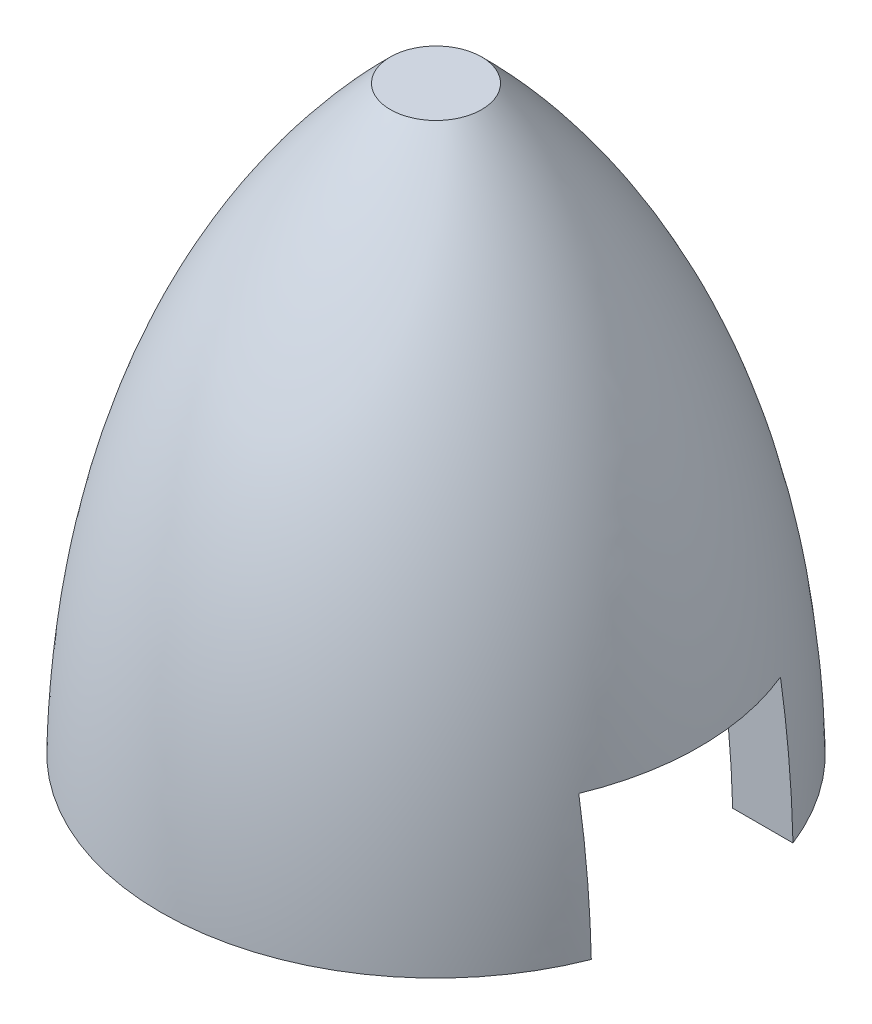
ISO-10303-21;
HEADER;
FILE_DESCRIPTION(('STEP AP214'),'2;1');
FILE_NAME('part.step','',(''),(''),'','','');
FILE_SCHEMA(('AUTOMOTIVE_DESIGN { 1 0 10303 214 1 1 1 1 }'));
ENDSEC;
DATA;
#1=APPLICATION_CONTEXT('core data for automotive mechanical design processes');
#2=APPLICATION_PROTOCOL_DEFINITION('international standard','automotive_design',2000,#1);
#3=PRODUCT_CONTEXT('',#1,'mechanical');
#4=PRODUCT('Part','Part','',(#3));
#5=PRODUCT_RELATED_PRODUCT_CATEGORY('part','',(#4));
#6=PRODUCT_DEFINITION_FORMATION('','',#4);
#7=PRODUCT_DEFINITION_CONTEXT('part definition',#1,'design');
#8=PRODUCT_DEFINITION('design','',#6,#7);
#9=PRODUCT_DEFINITION_SHAPE('','',#8);
#10=(LENGTH_UNIT() NAMED_UNIT(*) SI_UNIT(.MILLI.,.METRE.));
#11=(NAMED_UNIT(*) PLANE_ANGLE_UNIT() SI_UNIT($,.RADIAN.));
#12=(NAMED_UNIT(*) SI_UNIT($,.STERADIAN.) SOLID_ANGLE_UNIT());
#13=UNCERTAINTY_MEASURE_WITH_UNIT(LENGTH_MEASURE(1.E-05),#10,'distance_accuracy_value','');
#14=(GEOMETRIC_REPRESENTATION_CONTEXT(3) GLOBAL_UNCERTAINTY_ASSIGNED_CONTEXT((#13)) GLOBAL_UNIT_ASSIGNED_CONTEXT((#10,
#11,#12)) REPRESENTATION_CONTEXT('',''));
#15=CARTESIAN_POINT('',(0.,0.,0.));
#16=DIRECTION('',(0.,0.,1.));
#17=DIRECTION('',(1.,0.,0.));
#18=AXIS2_PLACEMENT_3D('',#15,#16,#17);
#19=CARTESIAN_POINT('',(0.,0.,0.));
#20=DIRECTION('',(0.,1.,0.));
#21=DIRECTION('',(0.,0.,1.));
#22=AXIS2_PLACEMENT_3D('',#19,#20,#21);
#23=PLANE('',#22);
#24=CARTESIAN_POINT('',(0.,0.,0.));
#25=DIRECTION('',(0.,-1.,0.));
#26=DIRECTION('',(0.,0.,-1.));
#27=AXIS2_PLACEMENT_3D('',#24,#25,#26);
#28=CIRCLE('',#27,15.013112957631);
#29=CARTESIAN_POINT('',(13.9693793948975,0.,5.5));
#30=VERTEX_POINT('',#29);
#31=CARTESIAN_POINT('',(-13.9693793948975,0.,5.5));
#32=VERTEX_POINT('',#31);
#33=EDGE_CURVE('E207',#30,#32,#28,.T.);
#34=ORIENTED_EDGE('',*,*,#33,.T.);
#35=DIRECTION('',(1.,0.,0.));
#36=VECTOR('',#35,1.);
#37=CARTESIAN_POINT('',(0.,0.,5.5));
#38=LINE('',#37,#36);
#39=CARTESIAN_POINT('',(-10.6790847882653,0.,5.5));
#40=VERTEX_POINT('',#39);
#41=EDGE_CURVE('E135',#32,#40,#38,.T.);
#42=ORIENTED_EDGE('',*,*,#41,.T.);
#43=CARTESIAN_POINT('',(0.,0.,0.));
#44=DIRECTION('',(0.,-1.,0.));
#45=DIRECTION('',(0.,0.,-1.));
#46=AXIS2_PLACEMENT_3D('',#43,#44,#45);
#47=CIRCLE('',#46,12.0121959655576);
#48=CARTESIAN_POINT('',(10.6790847882653,0.,5.5));
#49=VERTEX_POINT('',#48);
#50=EDGE_CURVE('E210',#49,#40,#47,.T.);
#51=ORIENTED_EDGE('',*,*,#50,.F.);
#52=EDGE_CURVE('E129',#49,#30,#38,.T.);
#53=ORIENTED_EDGE('',*,*,#52,.T.);
#54=EDGE_LOOP('',(#34,#42,#51,#53));
#55=FACE_BOUND('',#54,.T.);
#56=ADVANCED_FACE('F36',(#55),#23,.F.);
#57=CARTESIAN_POINT('',(0.,28.65,-7.25916431293584E-13));
#58=DIRECTION('',(0.,-1.,0.));
#59=DIRECTION('',(0.,0.,-1.));
#60=AXIS2_PLACEMENT_3D('',#57,#58,#59);
#61=PLANE('',#60);
#62=CARTESIAN_POINT('',(0.,28.65,0.));
#63=DIRECTION('',(0.,-1.,0.));
#64=DIRECTION('',(0.,0.,-1.));
#65=AXIS2_PLACEMENT_3D('',#62,#63,#64);
#66=CIRCLE('',#65,1.23236898628547);
#67=CARTESIAN_POINT('',(0.,28.65,-1.23236898628547));
#68=VERTEX_POINT('',#67);
#69=EDGE_CURVE('E211',#68,#68,#66,.T.);
#70=ORIENTED_EDGE('',*,*,#69,.T.);
#71=EDGE_LOOP('',(#70));
#72=FACE_BOUND('',#71,.T.);
#73=ADVANCED_FACE('F38',(#72),#61,.T.);
#74=CARTESIAN_POINT('',(0.,28.65,-1.23236898628547));
#75=CARTESIAN_POINT('',(0.,24.582684724084,-5.10461167577908));
#76=CARTESIAN_POINT('',(0.,16.2274406713024,-9.23648868604347));
#77=CARTESIAN_POINT('',(0.,6.72392906960263,-11.849259979813));
#78=CARTESIAN_POINT('',(0.,-0.0695843047188945,-12.0139200621111));
#79=B_SPLINE_CURVE_WITH_KNOTS('',2,(#74,#75,#76,#77,#78),.UNSPECIFIED.,.F.,.F.,(3,1,1,3),(0.,
0.343216430039935,0.572027383399892,0.915243813439828),.UNSPECIFIED.);
#80=CARTESIAN_POINT('',(0.,0.,0.));
#81=DIRECTION('',(0.,-1.,0.));
#82=AXIS1_PLACEMENT('',#80,#81);
#83=SURFACE_OF_REVOLUTION('',#79,#82);
#84=CARTESIAN_POINT('',(-9.91919515110103,7.5,5.5));
#85=CARTESIAN_POINT('',(-9.96452279919831,7.25221647945779,5.5));
#86=CARTESIAN_POINT('',(-10.0076600351709,7.00403485773184,5.5));
#87=CARTESIAN_POINT('',(-10.0896333627202,6.50721653803283,5.5));
#88=CARTESIAN_POINT('',(-10.128473707039,6.25858054212957,5.5));
#89=CARTESIAN_POINT('',(-10.201997020265,5.76087506112865,5.5));
#90=CARTESIAN_POINT('',(-10.2366829053883,5.51180600609312,5.5));
#91=CARTESIAN_POINT('',(-10.302029476121,5.01325242074924,5.5));
#92=CARTESIAN_POINT('',(-10.3326919252833,4.76376812133957,5.5));
#93=CARTESIAN_POINT('',(-10.3901148466553,4.26440130215909,5.5));
#94=CARTESIAN_POINT('',(-10.4168760862902,4.01451887051043,5.5));
#95=CARTESIAN_POINT('',(-10.4666081057527,3.51440506892114,5.5));
#96=CARTESIAN_POINT('',(-10.4895792970188,3.26417373983405,5.5));
#97=CARTESIAN_POINT('',(-10.5318436855347,2.76333448306963,5.5));
#98=CARTESIAN_POINT('',(-10.5511359074675,2.51272647322996,5.5));
#99=CARTESIAN_POINT('',(-10.5861429821154,2.01114006223054,5.5));
#100=CARTESIAN_POINT('',(-10.6018561101243,1.76016154091047,5.5));
#101=CARTESIAN_POINT('',(-10.6297992391513,1.25784016843244,5.5));
#102=CARTESIAN_POINT('',(-10.642026865357,1.0064971855891,5.5));
#103=CARTESIAN_POINT('',(-10.6630862464183,0.503451501429069,5.5));
#104=CARTESIAN_POINT('',(-10.6719150617141,0.251748676863807,5.5));
#105=CARTESIAN_POINT('',(-10.6790847882653,0.,5.5));
#106=B_SPLINE_CURVE_WITH_KNOTS('',3,(#84,#85,#86,#87,#88,#89,#90,#91,#92,#93,#94,#95,#96,#97,
#98,#99,#100,#101,#102,#103,#104,#105),.UNSPECIFIED.,.F.,.F.,(4,2,2,2,2,2,2,2,2,2,4),(0.,
0.755672477473455,1.51059022640549,2.26497491718871,3.01902783349909,3.77293221581182,
4.5267547021852,5.28077675447336,6.03516139240376,6.7900588009751,7.54560764533241),.UNSPECIFIED.);
#107=CARTESIAN_POINT('',(-9.91919515110103,7.5,5.5));
#108=VERTEX_POINT('',#107);
#109=EDGE_CURVE('E128',#108,#40,#106,.T.);
#110=ORIENTED_EDGE('',*,*,#109,.F.);
#111=CARTESIAN_POINT('',(0.,7.5,0.));
#112=DIRECTION('',(0.,-1.,0.));
#113=DIRECTION('',(0.,0.,-1.));
#114=AXIS2_PLACEMENT_3D('',#111,#112,#113);
#115=CIRCLE('',#114,11.3419765669669);
#116=CARTESIAN_POINT('',(-9.91919515110103,7.5,-5.5));
#117=VERTEX_POINT('',#116);
#118=EDGE_CURVE('E116',#117,#108,#115,.F.);
#119=ORIENTED_EDGE('',*,*,#118,.F.);
#120=CARTESIAN_POINT('',(-10.6790847882653,0.,-5.5));
#121=CARTESIAN_POINT('',(-10.6719150617141,0.251748676863807,-5.5));
#122=CARTESIAN_POINT('',(-10.6630862464183,0.503451501429069,-5.5));
#123=CARTESIAN_POINT('',(-10.642026865357,1.0064971855891,-5.5));
#124=CARTESIAN_POINT('',(-10.6297992391513,1.25784016843244,-5.5));
#125=CARTESIAN_POINT('',(-10.6018561101243,1.76016154091047,-5.5));
#126=CARTESIAN_POINT('',(-10.5861429821154,2.01114006223054,-5.5));
#127=CARTESIAN_POINT('',(-10.5511359074675,2.51272647322996,-5.5));
#128=CARTESIAN_POINT('',(-10.5318436855347,2.76333448306963,-5.5));
#129=CARTESIAN_POINT('',(-10.4895792970188,3.26417373983405,-5.5));
#130=CARTESIAN_POINT('',(-10.4666081057527,3.51440506892114,-5.5));
#131=CARTESIAN_POINT('',(-10.4168760862902,4.01451887051042,-5.5));
#132=CARTESIAN_POINT('',(-10.3901148466553,4.26440130215909,-5.5));
#133=CARTESIAN_POINT('',(-10.3326919252833,4.76376812133957,-5.5));
#134=CARTESIAN_POINT('',(-10.302029476121,5.01325242074924,-5.5));
#135=CARTESIAN_POINT('',(-10.2366829053883,5.51180600609312,-5.5));
#136=CARTESIAN_POINT('',(-10.201997020265,5.76087506112865,-5.5));
#137=CARTESIAN_POINT('',(-10.128473707039,6.25858054212956,-5.5));
#138=CARTESIAN_POINT('',(-10.0896333627202,6.50721653803283,-5.5));
#139=CARTESIAN_POINT('',(-10.0076600351709,7.00403485773183,-5.5));
#140=CARTESIAN_POINT('',(-9.96452279919831,7.25221647945779,-5.5));
#141=CARTESIAN_POINT('',(-9.91919515110103,7.49999999999999,-5.5));
#142=B_SPLINE_CURVE_WITH_KNOTS('',3,(#120,#121,#122,#123,#124,#125,#126,#127,#128,#129,#130,
#131,#132,#133,#134,#135,#136,#137,#138,#139,#140,#141),.UNSPECIFIED.,.F.,.F.,(4,2,2,2,2,2,2,2,
2,2,4),(0.,0.755548844357308,1.51044625292865,2.26483089085904,3.01885294314721,
3.77267542952058,4.52657981183332,5.2806327281437,6.03501741892691,6.78993516785895,
7.5456076453324),.UNSPECIFIED.);
#143=CARTESIAN_POINT('',(-10.6790847882653,0.,-5.5));
#144=VERTEX_POINT('',#143);
#145=EDGE_CURVE('E104',#144,#117,#142,.T.);
#146=ORIENTED_EDGE('',*,*,#145,.F.);
#147=CARTESIAN_POINT('',(10.6790847882653,0.,-5.5));
#148=VERTEX_POINT('',#147);
#149=EDGE_CURVE('E208',#144,#148,#47,.T.);
#150=ORIENTED_EDGE('',*,*,#149,.T.);
#151=CARTESIAN_POINT('',(9.91919515110103,7.5,-5.5));
#152=CARTESIAN_POINT('',(9.96452279919831,7.25221647945779,-5.5));
#153=CARTESIAN_POINT('',(10.0076600351709,7.00403485773183,-5.5));
#154=CARTESIAN_POINT('',(10.0896333627202,6.50721653803283,-5.5));
#155=CARTESIAN_POINT('',(10.128473707039,6.25858054212957,-5.5));
#156=CARTESIAN_POINT('',(10.201997020265,5.76087506112865,-5.5));
#157=CARTESIAN_POINT('',(10.2366829053883,5.51180600609312,-5.5));
#158=CARTESIAN_POINT('',(10.302029476121,5.01325242074924,-5.5));
#159=CARTESIAN_POINT('',(10.3326919252833,4.76376812133957,-5.5));
#160=CARTESIAN_POINT('',(10.3901148466553,4.26440130215909,-5.5));
#161=CARTESIAN_POINT('',(10.4168760862902,4.01451887051042,-5.5));
#162=CARTESIAN_POINT('',(10.4666081057527,3.51440506892114,-5.5));
#163=CARTESIAN_POINT('',(10.4895792970188,3.26417373983405,-5.5));
#164=CARTESIAN_POINT('',(10.5318436855347,2.76333448306963,-5.5));
#165=CARTESIAN_POINT('',(10.5511359074675,2.51272647322996,-5.5));
#166=CARTESIAN_POINT('',(10.5861429821154,2.01114006223054,-5.5));
#167=CARTESIAN_POINT('',(10.6018561101243,1.76016154091047,-5.5));
#168=CARTESIAN_POINT('',(10.6297992391513,1.25784016843244,-5.5));
#169=CARTESIAN_POINT('',(10.642026865357,1.0064971855891,-5.5));
#170=CARTESIAN_POINT('',(10.6630862464183,0.503451501429069,-5.5));
#171=CARTESIAN_POINT('',(10.6719150617141,0.251748676863807,-5.5));
#172=CARTESIAN_POINT('',(10.6790847882653,0.,-5.5));
#173=B_SPLINE_CURVE_WITH_KNOTS('',3,(#151,#152,#153,#154,#155,#156,#157,#158,#159,#160,#161,
#162,#163,#164,#165,#166,#167,#168,#169,#170,#171,#172),.UNSPECIFIED.,.F.,.F.,(4,2,2,2,2,2,2,2,
2,2,4),(0.,0.755672477473454,1.51059022640549,2.26497491718871,3.01902783349909,
3.77293221581182,4.5267547021852,5.28077675447336,6.03516139240375,6.7900588009751,
7.5456076453324),.UNSPECIFIED.);
#174=CARTESIAN_POINT('',(9.91919515110103,7.5,-5.5));
#175=VERTEX_POINT('',#174);
#176=EDGE_CURVE('E136',#175,#148,#173,.T.);
#177=ORIENTED_EDGE('',*,*,#176,.F.);
#178=CARTESIAN_POINT('',(9.91919515110103,7.5,5.5));
#179=VERTEX_POINT('',#178);
#180=EDGE_CURVE('E130',#179,#175,#115,.F.);
#181=ORIENTED_EDGE('',*,*,#180,.F.);
#182=CARTESIAN_POINT('',(10.6790847882653,0.,5.5));
#183=CARTESIAN_POINT('',(10.6719150617141,0.251748676863807,5.5));
#184=CARTESIAN_POINT('',(10.6630862464183,0.50345150142907,5.5));
#185=CARTESIAN_POINT('',(10.642026865357,1.0064971855891,5.5));
#186=CARTESIAN_POINT('',(10.6297992391513,1.25784016843244,5.5));
#187=CARTESIAN_POINT('',(10.6018561101243,1.76016154091048,5.5));
#188=CARTESIAN_POINT('',(10.5861429821154,2.01114006223055,5.5));
#189=CARTESIAN_POINT('',(10.5511359074675,2.51272647322996,5.5));
#190=CARTESIAN_POINT('',(10.5318436855347,2.76333448306963,5.5));
#191=CARTESIAN_POINT('',(10.4895792970188,3.26417373983405,5.5));
#192=CARTESIAN_POINT('',(10.4666081057527,3.51440506892114,5.5));
#193=CARTESIAN_POINT('',(10.4168760862902,4.01451887051043,5.5));
#194=CARTESIAN_POINT('',(10.3901148466553,4.26440130215909,5.5));
#195=CARTESIAN_POINT('',(10.3326919252833,4.76376812133957,5.5));
#196=CARTESIAN_POINT('',(10.302029476121,5.01325242074924,5.5));
#197=CARTESIAN_POINT('',(10.2366829053883,5.51180600609312,5.5));
#198=CARTESIAN_POINT('',(10.201997020265,5.76087506112866,5.5));
#199=CARTESIAN_POINT('',(10.128473707039,6.25858054212957,5.5));
#200=CARTESIAN_POINT('',(10.0896333627202,6.50721653803283,5.5));
#201=CARTESIAN_POINT('',(10.0076600351709,7.00403485773184,5.5));
#202=CARTESIAN_POINT('',(9.96452279919831,7.25221647945779,5.5));
#203=CARTESIAN_POINT('',(9.91919515110103,7.5,5.5));
#204=B_SPLINE_CURVE_WITH_KNOTS('',3,(#182,#183,#184,#185,#186,#187,#188,#189,#190,#191,#192,
#193,#194,#195,#196,#197,#198,#199,#200,#201,#202,#203),.UNSPECIFIED.,.F.,.F.,(4,2,2,2,2,2,2,2,
2,2,4),(0.,0.755548844357308,1.51044625292865,2.26483089085904,3.01885294314721,
3.77267542952058,4.52657981183332,5.2806327281437,6.03501741892692,6.78993516785895,
7.54560764533241),.UNSPECIFIED.);
#205=EDGE_CURVE('E133',#49,#179,#204,.T.);
#206=ORIENTED_EDGE('',*,*,#205,.F.);
#207=ORIENTED_EDGE('',*,*,#50,.T.);
#208=EDGE_LOOP('',(#110,#119,#146,#150,#177,#181,#206,#207));
#209=FACE_BOUND('',#208,.T.);
#210=ORIENTED_EDGE('',*,*,#69,.F.);
#211=EDGE_LOOP('',(#210));
#212=FACE_BOUND('',#211,.T.);
#213=ADVANCED_FACE('F125',(#209,#212),#83,.F.);
#214=CARTESIAN_POINT('',(-13.9693793948975,0.,-5.5));
#215=VERTEX_POINT('',#214);
#216=CARTESIAN_POINT('',(13.9693793948975,0.,-5.5));
#217=VERTEX_POINT('',#216);
#218=EDGE_CURVE('E204',#215,#217,#28,.T.);
#219=ORIENTED_EDGE('',*,*,#218,.T.);
#220=DIRECTION('',(-1.,0.,0.));
#221=VECTOR('',#220,1.);
#222=CARTESIAN_POINT('',(0.,0.,-5.5));
#223=LINE('',#222,#221);
#224=EDGE_CURVE('E65',#217,#148,#223,.T.);
#225=ORIENTED_EDGE('',*,*,#224,.T.);
#226=ORIENTED_EDGE('',*,*,#149,.F.);
#227=EDGE_CURVE('E107',#144,#215,#223,.T.);
#228=ORIENTED_EDGE('',*,*,#227,.T.);
#229=EDGE_LOOP('',(#219,#225,#226,#228));
#230=FACE_BOUND('',#229,.T.);
#231=ADVANCED_FACE('F187',(#230),#23,.F.);
#232=CARTESIAN_POINT('',(0.,0.,-15.013112957631));
#233=CARTESIAN_POINT('',(0.,19.7502569476166,-14.5548870463292));
#234=CARTESIAN_POINT('',(0.,31.65,-2.49002407353327));
#235=B_SPLINE_CURVE_WITH_KNOTS('',2,(#232,#233,#234),.UNSPECIFIED.,.F.,.F.,(3,3),(0.,
0.952040091588496),.UNSPECIFIED.);
#236=CARTESIAN_POINT('',(0.,0.,0.));
#237=DIRECTION('',(0.,-1.,0.));
#238=AXIS1_PLACEMENT('',#236,#237);
#239=SURFACE_OF_REVOLUTION('',#235,#238);
#240=CARTESIAN_POINT('',(13.2851599208935,7.5,5.5));
#241=CARTESIAN_POINT('',(13.3257879234162,7.25176945875079,5.5));
#242=CARTESIAN_POINT('',(13.3645078180459,7.00322807168249,5.5));
#243=CARTESIAN_POINT('',(13.4381791999583,6.50578972094799,5.5));
#244=CARTESIAN_POINT('',(13.4731336673364,6.25689319880967,5.5));
#245=CARTESIAN_POINT('',(13.5393675887499,5.75875718425568,5.5));
#246=CARTESIAN_POINT('',(13.5706491341771,5.50951796957846,5.5));
#247=CARTESIAN_POINT('',(13.6296257153032,5.01070747640192,5.5));
#248=CARTESIAN_POINT('',(13.657322046229,4.76113635091622,5.5));
#249=CARTESIAN_POINT('',(13.7092123703643,4.26167266220284,5.5));
#250=CARTESIAN_POINT('',(13.7334069460042,4.01178015942005,5.5));
#251=CARTESIAN_POINT('',(13.7783719663748,3.5117049159592,5.5));
#252=CARTESIAN_POINT('',(13.7991426459228,3.26152219637083,5.5));
#253=CARTESIAN_POINT('',(13.8373391357311,2.7608492101517,5.5));
#254=CARTESIAN_POINT('',(13.8547642447222,2.51035889009414,5.5));
#255=CARTESIAN_POINT('',(13.8863424847391,2.00907476300904,5.5));
#256=CARTESIAN_POINT('',(13.9004943430148,1.75828087591846,5.5));
#257=CARTESIAN_POINT('',(13.9255955274766,1.25639365696695,5.5));
#258=CARTESIAN_POINT('',(13.9365430703917,1.00530023615515,5.5));
#259=CARTESIAN_POINT('',(13.9553013905422,0.502817066911132,5.5));
#260=CARTESIAN_POINT('',(13.9631099287566,0.251427234785786,5.5));
#261=CARTESIAN_POINT('',(13.9693793948975,0.,5.5));
#262=B_SPLINE_CURVE_WITH_KNOTS('',3,(#240,#241,#242,#243,#244,#245,#246,#247,#248,#249,#250,
#251,#252,#253,#254,#255,#256,#257,#258,#259,#260,#261),.UNSPECIFIED.,.F.,.F.,(4,2,2,2,2,2,2,2,
2,2,4),(0.,0.754590575220789,1.50857948320297,2.26213695999876,3.0154214355112,3.76858047644237,
4.52168784277764,5.27495289695445,6.02851035542141,6.78248639106071,7.53699928014955),.UNSPECIFIED.);
#263=CARTESIAN_POINT('',(13.2851599208935,7.5,5.5));
#264=VERTEX_POINT('',#263);
#265=EDGE_CURVE('E11',#264,#30,#262,.T.);
#266=ORIENTED_EDGE('',*,*,#265,.F.);
#267=CARTESIAN_POINT('',(0.,7.5,0.));
#268=DIRECTION('',(0.,-1.,0.));
#269=DIRECTION('',(0.,0.,-1.));
#270=AXIS2_PLACEMENT_3D('',#267,#268,#269);
#271=CIRCLE('',#270,14.3786464635485);
#272=CARTESIAN_POINT('',(13.2851599208935,7.5,-5.5));
#273=VERTEX_POINT('',#272);
#274=EDGE_CURVE('E50',#273,#264,#271,.T.);
#275=ORIENTED_EDGE('',*,*,#274,.F.);
#276=CARTESIAN_POINT('',(13.9693793948975,0.,-5.5));
#277=CARTESIAN_POINT('',(13.9631099287566,0.251427234785786,-5.5));
#278=CARTESIAN_POINT('',(13.9553013905422,0.502817066911132,-5.5));
#279=CARTESIAN_POINT('',(13.9365430703917,1.00530023615515,-5.5));
#280=CARTESIAN_POINT('',(13.9255955274766,1.25639365696695,-5.5));
#281=CARTESIAN_POINT('',(13.9004943430148,1.75828087591846,-5.5));
#282=CARTESIAN_POINT('',(13.8863424847391,2.00907476300904,-5.5));
#283=CARTESIAN_POINT('',(13.8547642447222,2.51035889009414,-5.5));
#284=CARTESIAN_POINT('',(13.8373391357311,2.7608492101517,-5.5));
#285=CARTESIAN_POINT('',(13.7991426459228,3.26152219637083,-5.5));
#286=CARTESIAN_POINT('',(13.7783719663748,3.5117049159592,-5.5));
#287=CARTESIAN_POINT('',(13.7334069460042,4.01178015942005,-5.5));
#288=CARTESIAN_POINT('',(13.7092123703643,4.26167266220284,-5.5));
#289=CARTESIAN_POINT('',(13.657322046229,4.76113635091622,-5.5));
#290=CARTESIAN_POINT('',(13.6296257153032,5.01070747640192,-5.5));
#291=CARTESIAN_POINT('',(13.5706491341771,5.50951796957846,-5.5));
#292=CARTESIAN_POINT('',(13.5393675887499,5.75875718425568,-5.5));
#293=CARTESIAN_POINT('',(13.4731336673364,6.25689319880967,-5.5));
#294=CARTESIAN_POINT('',(13.4381791999583,6.50578972094799,-5.5));
#295=CARTESIAN_POINT('',(13.3645078180459,7.00322807168249,-5.5));
#296=CARTESIAN_POINT('',(13.3257879234162,7.25176945875079,-5.5));
#297=CARTESIAN_POINT('',(13.2851599208935,7.5,-5.5));
#298=B_SPLINE_CURVE_WITH_KNOTS('',3,(#276,#277,#278,#279,#280,#281,#282,#283,#284,#285,#286,
#287,#288,#289,#290,#291,#292,#293,#294,#295,#296,#297),.UNSPECIFIED.,.F.,.F.,(4,2,2,2,2,2,2,2,
2,2,4),(0.,0.754512889088833,1.50848892472814,2.2620463831951,3.0153114373719,3.76841880370718,
4.52157784463835,5.27486232015079,6.02841979694657,6.78240870492876,7.53699928014955),.UNSPECIFIED.);
#299=EDGE_CURVE('E177',#217,#273,#298,.T.);
#300=ORIENTED_EDGE('',*,*,#299,.F.);
#301=ORIENTED_EDGE('',*,*,#218,.F.);
#302=CARTESIAN_POINT('',(-13.2851599208935,7.5,-5.5));
#303=CARTESIAN_POINT('',(-13.3257879234162,7.25176945875079,-5.5));
#304=CARTESIAN_POINT('',(-13.3645078180459,7.00322807168249,-5.5));
#305=CARTESIAN_POINT('',(-13.4381791999583,6.50578972094799,-5.5));
#306=CARTESIAN_POINT('',(-13.4731336673364,6.25689319880967,-5.5));
#307=CARTESIAN_POINT('',(-13.5393675887499,5.75875718425568,-5.5));
#308=CARTESIAN_POINT('',(-13.5706491341771,5.50951796957846,-5.5));
#309=CARTESIAN_POINT('',(-13.6296257153032,5.01070747640192,-5.5));
#310=CARTESIAN_POINT('',(-13.657322046229,4.76113635091622,-5.5));
#311=CARTESIAN_POINT('',(-13.7092123703643,4.26167266220284,-5.5));
#312=CARTESIAN_POINT('',(-13.7334069460042,4.01178015942005,-5.5));
#313=CARTESIAN_POINT('',(-13.7783719663748,3.5117049159592,-5.5));
#314=CARTESIAN_POINT('',(-13.7991426459228,3.26152219637083,-5.5));
#315=CARTESIAN_POINT('',(-13.8373391357311,2.7608492101517,-5.5));
#316=CARTESIAN_POINT('',(-13.8547642447222,2.51035889009414,-5.5));
#317=CARTESIAN_POINT('',(-13.8863424847391,2.00907476300904,-5.5));
#318=CARTESIAN_POINT('',(-13.9004943430148,1.75828087591846,-5.5));
#319=CARTESIAN_POINT('',(-13.9255955274766,1.25639365696695,-5.5));
#320=CARTESIAN_POINT('',(-13.9365430703917,1.00530023615515,-5.5));
#321=CARTESIAN_POINT('',(-13.9553013905422,0.502817066911132,-5.5));
#322=CARTESIAN_POINT('',(-13.9631099287566,0.251427234785786,-5.5));
#323=CARTESIAN_POINT('',(-13.9693793948975,0.,-5.50000000000001));
#324=B_SPLINE_CURVE_WITH_KNOTS('',3,(#302,#303,#304,#305,#306,#307,#308,#309,#310,#311,#312,
#313,#314,#315,#316,#317,#318,#319,#320,#321,#322,#323),.UNSPECIFIED.,.F.,.F.,(4,2,2,2,2,2,2,2,
2,2,4),(0.,0.75459057522079,1.50857948320297,2.26213695999876,3.0154214355112,3.76858047644237,
4.52168784277764,5.27495289695445,6.02851035542141,6.78248639106071,7.53699928014955),.UNSPECIFIED.);
#325=CARTESIAN_POINT('',(-13.2851599208935,7.5,-5.5));
#326=VERTEX_POINT('',#325);
#327=EDGE_CURVE('E213',#326,#215,#324,.T.);
#328=ORIENTED_EDGE('',*,*,#327,.F.);
#329=CARTESIAN_POINT('',(-13.2851599208935,7.5,5.5));
#330=VERTEX_POINT('',#329);
#331=EDGE_CURVE('E119',#330,#326,#271,.T.);
#332=ORIENTED_EDGE('',*,*,#331,.F.);
#333=CARTESIAN_POINT('',(-13.9693793948975,0.,5.5));
#334=CARTESIAN_POINT('',(-13.9631099287566,0.251427234785786,5.5));
#335=CARTESIAN_POINT('',(-13.9553013905422,0.502817066911132,5.5));
#336=CARTESIAN_POINT('',(-13.9365430703917,1.00530023615515,5.5));
#337=CARTESIAN_POINT('',(-13.9255955274766,1.25639365696695,5.5));
#338=CARTESIAN_POINT('',(-13.9004943430148,1.75828087591846,5.5));
#339=CARTESIAN_POINT('',(-13.8863424847391,2.00907476300904,5.5));
#340=CARTESIAN_POINT('',(-13.8547642447222,2.51035889009414,5.5));
#341=CARTESIAN_POINT('',(-13.8373391357311,2.7608492101517,5.5));
#342=CARTESIAN_POINT('',(-13.7991426459228,3.26152219637083,5.5));
#343=CARTESIAN_POINT('',(-13.7783719663748,3.5117049159592,5.5));
#344=CARTESIAN_POINT('',(-13.7334069460042,4.01178015942005,5.5));
#345=CARTESIAN_POINT('',(-13.7092123703643,4.26167266220284,5.5));
#346=CARTESIAN_POINT('',(-13.657322046229,4.76113635091622,5.5));
#347=CARTESIAN_POINT('',(-13.6296257153032,5.01070747640192,5.5));
#348=CARTESIAN_POINT('',(-13.5706491341771,5.50951796957846,5.5));
#349=CARTESIAN_POINT('',(-13.5393675887499,5.75875718425568,5.5));
#350=CARTESIAN_POINT('',(-13.4731336673364,6.25689319880967,5.5));
#351=CARTESIAN_POINT('',(-13.4381791999583,6.50578972094799,5.5));
#352=CARTESIAN_POINT('',(-13.3645078180459,7.00322807168249,5.5));
#353=CARTESIAN_POINT('',(-13.3257879234162,7.25176945875079,5.5));
#354=CARTESIAN_POINT('',(-13.2851599208935,7.5,5.50000000000001));
#355=B_SPLINE_CURVE_WITH_KNOTS('',3,(#333,#334,#335,#336,#337,#338,#339,#340,#341,#342,#343,
#344,#345,#346,#347,#348,#349,#350,#351,#352,#353,#354),.UNSPECIFIED.,.F.,.F.,(4,2,2,2,2,2,2,2,
2,2,4),(0.,0.754512889088833,1.50848892472814,2.2620463831951,3.0153114373719,3.76841880370718,
4.52157784463835,5.27486232015079,6.02841979694657,6.78240870492876,7.53699928014955),.UNSPECIFIED.);
#356=EDGE_CURVE('E170',#32,#330,#355,.T.);
#357=ORIENTED_EDGE('',*,*,#356,.F.);
#358=ORIENTED_EDGE('',*,*,#33,.F.);
#359=EDGE_LOOP('',(#266,#275,#300,#301,#328,#332,#357,#358));
#360=FACE_BOUND('',#359,.T.);
#361=CARTESIAN_POINT('',(0.,31.65,0.));
#362=DIRECTION('',(0.,-1.,0.));
#363=DIRECTION('',(0.,0.,-1.));
#364=AXIS2_PLACEMENT_3D('',#361,#362,#363);
#365=CIRCLE('',#364,2.49002407353327);
#366=CARTESIAN_POINT('',(0.,31.65,-2.49002407353327));
#367=VERTEX_POINT('',#366);
#368=EDGE_CURVE('E198',#367,#367,#365,.T.);
#369=ORIENTED_EDGE('',*,*,#368,.T.);
#370=EDGE_LOOP('',(#369));
#371=FACE_BOUND('',#370,.T.);
#372=ADVANCED_FACE('F183',(#360,#371),#239,.F.);
#373=CARTESIAN_POINT('',(0.,31.65,0.));
#374=DIRECTION('',(0.,-1.,0.));
#375=DIRECTION('',(0.,0.,-1.));
#376=AXIS2_PLACEMENT_3D('',#373,#374,#375);
#377=PLANE('',#376);
#378=ORIENTED_EDGE('',*,*,#368,.F.);
#379=EDGE_LOOP('',(#378));
#380=FACE_BOUND('',#379,.T.);
#381=ADVANCED_FACE('F166',(#380),#377,.F.);
#382=CARTESIAN_POINT('',(-25.,-7.5,-5.5));
#383=DIRECTION('',(0.,0.,-1.));
#384=DIRECTION('',(0.,1.,0.));
#385=AXIS2_PLACEMENT_3D('',#382,#383,#384);
#386=PLANE('',#385);
#387=ORIENTED_EDGE('',*,*,#145,.T.);
#388=DIRECTION('',(1.,0.,0.));
#389=VECTOR('',#388,1.);
#390=CARTESIAN_POINT('',(-25.,7.5,-5.5));
#391=LINE('',#390,#389);
#392=EDGE_CURVE('E57',#326,#117,#391,.T.);
#393=ORIENTED_EDGE('',*,*,#392,.F.);
#394=ORIENTED_EDGE('',*,*,#327,.T.);
#395=ORIENTED_EDGE('',*,*,#227,.F.);
#396=EDGE_LOOP('',(#387,#393,#394,#395));
#397=FACE_BOUND('',#396,.T.);
#398=ADVANCED_FACE('F105',(#397),#386,.F.);
#399=CARTESIAN_POINT('',(-25.,7.5,5.5));
#400=DIRECTION('',(0.,1.,0.));
#401=DIRECTION('',(0.,0.,1.));
#402=AXIS2_PLACEMENT_3D('',#399,#400,#401);
#403=PLANE('',#402);
#404=ORIENTED_EDGE('',*,*,#118,.T.);
#405=DIRECTION('',(1.,0.,0.));
#406=VECTOR('',#405,1.);
#407=CARTESIAN_POINT('',(-25.,7.5,5.5));
#408=LINE('',#407,#406);
#409=EDGE_CURVE('E236',#330,#108,#408,.T.);
#410=ORIENTED_EDGE('',*,*,#409,.F.);
#411=ORIENTED_EDGE('',*,*,#331,.T.);
#412=ORIENTED_EDGE('',*,*,#392,.T.);
#413=EDGE_LOOP('',(#404,#410,#411,#412));
#414=FACE_BOUND('',#413,.T.);
#415=ADVANCED_FACE('F114',(#414),#403,.F.);
#416=CARTESIAN_POINT('',(-25.,-7.5,5.5));
#417=DIRECTION('',(0.,0.,1.));
#418=DIRECTION('',(0.,-1.,0.));
#419=AXIS2_PLACEMENT_3D('',#416,#417,#418);
#420=PLANE('',#419);
#421=ORIENTED_EDGE('',*,*,#109,.T.);
#422=ORIENTED_EDGE('',*,*,#41,.F.);
#423=ORIENTED_EDGE('',*,*,#356,.T.);
#424=ORIENTED_EDGE('',*,*,#409,.T.);
#425=EDGE_LOOP('',(#421,#422,#423,#424));
#426=FACE_BOUND('',#425,.T.);
#427=ADVANCED_FACE('F163',(#426),#420,.F.);
#428=ORIENTED_EDGE('',*,*,#176,.T.);
#429=ORIENTED_EDGE('',*,*,#224,.F.);
#430=ORIENTED_EDGE('',*,*,#299,.T.);
#431=EDGE_CURVE('E122',#175,#273,#391,.T.);
#432=ORIENTED_EDGE('',*,*,#431,.F.);
#433=EDGE_LOOP('',(#428,#429,#430,#432));
#434=FACE_BOUND('',#433,.T.);
#435=ADVANCED_FACE('F161',(#434),#386,.F.);
#436=ORIENTED_EDGE('',*,*,#205,.T.);
#437=EDGE_CURVE('E121',#179,#264,#408,.T.);
#438=ORIENTED_EDGE('',*,*,#437,.T.);
#439=ORIENTED_EDGE('',*,*,#265,.T.);
#440=ORIENTED_EDGE('',*,*,#52,.F.);
#441=EDGE_LOOP('',(#436,#438,#439,#440));
#442=FACE_BOUND('',#441,.T.);
#443=ADVANCED_FACE('F156',(#442),#420,.F.);
#444=ORIENTED_EDGE('',*,*,#180,.T.);
#445=ORIENTED_EDGE('',*,*,#431,.T.);
#446=ORIENTED_EDGE('',*,*,#274,.T.);
#447=ORIENTED_EDGE('',*,*,#437,.F.);
#448=EDGE_LOOP('',(#444,#445,#446,#447));
#449=FACE_BOUND('',#448,.T.);
#450=ADVANCED_FACE('F160',(#449),#403,.F.);
#451=CLOSED_SHELL('',(#56,#73,#213,#231,#372,#381,#398,#415,#427,#435,#443,#450));
#452=MANIFOLD_SOLID_BREP('B2',#451);
#453=ADVANCED_BREP_SHAPE_REPRESENTATION('',(#18,#452),#14);
#454=SHAPE_DEFINITION_REPRESENTATION(#9,#453);
ENDSEC;
END-ISO-10303-21;
